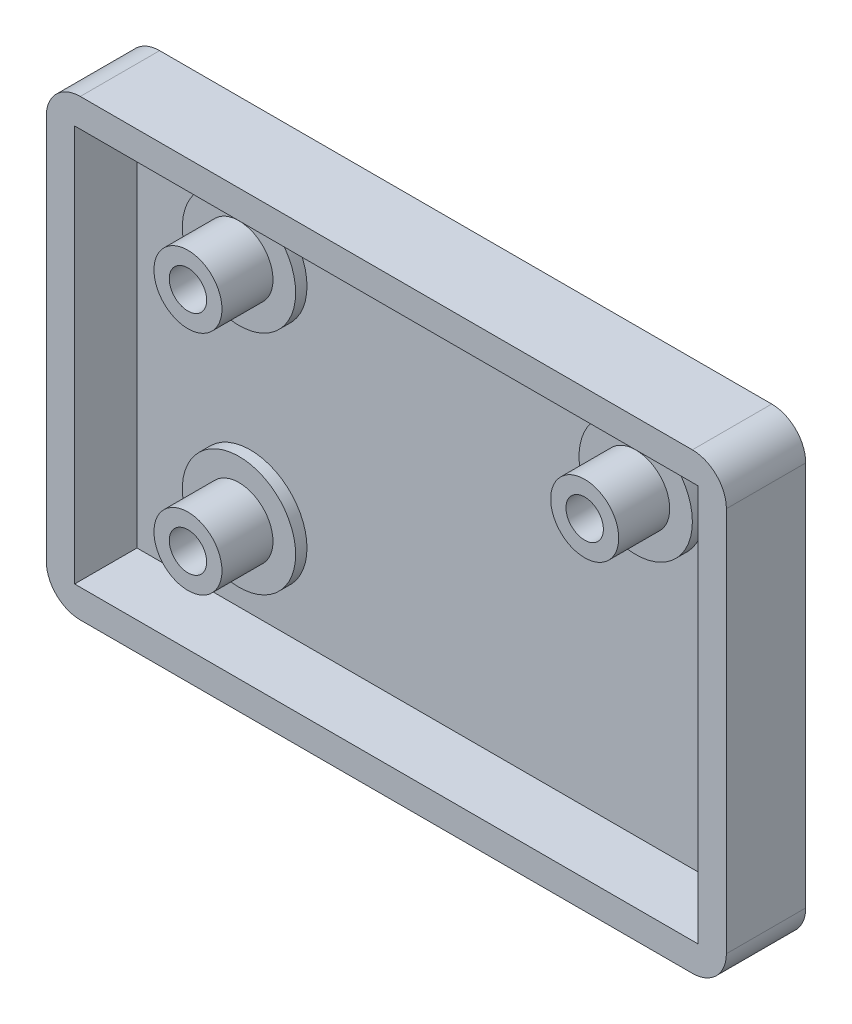
ISO-10303-21;
HEADER;
FILE_DESCRIPTION(('STEP AP214'),'2;1');
FILE_NAME('part.step','',(''),(''),'','','');
FILE_SCHEMA(('AUTOMOTIVE_DESIGN { 1 0 10303 214 1 1 1 1 }'));
ENDSEC;
DATA;
#1=APPLICATION_CONTEXT('core data for automotive mechanical design processes');
#2=APPLICATION_PROTOCOL_DEFINITION('international standard','automotive_design',2000,#1);
#3=PRODUCT_CONTEXT('',#1,'mechanical');
#4=PRODUCT('Part','Part','',(#3));
#5=PRODUCT_RELATED_PRODUCT_CATEGORY('part','',(#4));
#6=PRODUCT_DEFINITION_FORMATION('','',#4);
#7=PRODUCT_DEFINITION_CONTEXT('part definition',#1,'design');
#8=PRODUCT_DEFINITION('design','',#6,#7);
#9=PRODUCT_DEFINITION_SHAPE('','',#8);
#10=(LENGTH_UNIT() NAMED_UNIT(*) SI_UNIT(.MILLI.,.METRE.));
#11=(NAMED_UNIT(*) PLANE_ANGLE_UNIT() SI_UNIT($,.RADIAN.));
#12=(NAMED_UNIT(*) SI_UNIT($,.STERADIAN.) SOLID_ANGLE_UNIT());
#13=UNCERTAINTY_MEASURE_WITH_UNIT(LENGTH_MEASURE(1.E-05),#10,'distance_accuracy_value','');
#14=(GEOMETRIC_REPRESENTATION_CONTEXT(3) GLOBAL_UNCERTAINTY_ASSIGNED_CONTEXT((#13)) GLOBAL_UNIT_ASSIGNED_CONTEXT((#10,
#11,#12)) REPRESENTATION_CONTEXT('',''));
#15=CARTESIAN_POINT('',(0.,0.,0.));
#16=DIRECTION('',(0.,0.,1.));
#17=DIRECTION('',(1.,0.,0.));
#18=AXIS2_PLACEMENT_3D('',#15,#16,#17);
#19=CARTESIAN_POINT('',(-17.5,-10.,2.5));
#20=DIRECTION('',(0.,0.,1.));
#21=DIRECTION('',(1.,0.,0.));
#22=AXIS2_PLACEMENT_3D('',#19,#20,#21);
#23=PLANE('',#22);
#24=CARTESIAN_POINT('',(-17.5,-10.,2.5));
#25=DIRECTION('',(0.,0.,1.));
#26=DIRECTION('',(1.,0.,0.));
#27=AXIS2_PLACEMENT_3D('',#24,#25,#26);
#28=CIRCLE('',#27,5.);
#29=CARTESIAN_POINT('',(-12.5,-10.,2.5));
#30=VERTEX_POINT('',#29);
#31=EDGE_CURVE('E508',#30,#30,#28,.T.);
#32=ORIENTED_EDGE('',*,*,#31,.T.);
#33=EDGE_LOOP('',(#32));
#34=FACE_BOUND('',#33,.T.);
#35=CARTESIAN_POINT('',(-17.5,-10.,2.5));
#36=DIRECTION('',(0.,0.,1.));
#37=DIRECTION('',(1.,0.,0.));
#38=AXIS2_PLACEMENT_3D('',#35,#36,#37);
#39=CIRCLE('',#38,3.);
#40=CARTESIAN_POINT('',(-14.5,-10.,2.5));
#41=VERTEX_POINT('',#40);
#42=EDGE_CURVE('E482',#41,#41,#39,.T.);
#43=ORIENTED_EDGE('',*,*,#42,.F.);
#44=EDGE_LOOP('',(#43));
#45=FACE_BOUND('',#44,.T.);
#46=ADVANCED_FACE('F33',(#34,#45),#23,.T.);
#47=CARTESIAN_POINT('',(17.5,10.,2.5));
#48=DIRECTION('',(0.,0.,1.));
#49=DIRECTION('',(1.,0.,0.));
#50=AXIS2_PLACEMENT_3D('',#47,#48,#49);
#51=PLANE('',#50);
#52=CARTESIAN_POINT('',(17.5,10.,2.5));
#53=DIRECTION('',(0.,0.,1.));
#54=DIRECTION('',(1.,0.,0.));
#55=AXIS2_PLACEMENT_3D('',#52,#53,#54);
#56=CIRCLE('',#55,5.);
#57=CARTESIAN_POINT('',(22.5,10.,2.5));
#58=VERTEX_POINT('',#57);
#59=EDGE_CURVE('E513',#58,#58,#56,.T.);
#60=ORIENTED_EDGE('',*,*,#59,.T.);
#61=EDGE_LOOP('',(#60));
#62=FACE_BOUND('',#61,.T.);
#63=CARTESIAN_POINT('',(17.5,10.,2.5));
#64=DIRECTION('',(0.,0.,1.));
#65=DIRECTION('',(1.,0.,0.));
#66=AXIS2_PLACEMENT_3D('',#63,#64,#65);
#67=CIRCLE('',#66,3.);
#68=CARTESIAN_POINT('',(20.5,10.,2.5));
#69=VERTEX_POINT('',#68);
#70=EDGE_CURVE('E492',#69,#69,#67,.T.);
#71=ORIENTED_EDGE('',*,*,#70,.F.);
#72=EDGE_LOOP('',(#71));
#73=FACE_BOUND('',#72,.T.);
#74=ADVANCED_FACE('F263',(#62,#73),#51,.T.);
#75=CARTESIAN_POINT('',(-17.5,10.,2.5));
#76=DIRECTION('',(0.,0.,1.));
#77=DIRECTION('',(1.,0.,0.));
#78=AXIS2_PLACEMENT_3D('',#75,#76,#77);
#79=PLANE('',#78);
#80=CARTESIAN_POINT('',(-17.5,10.,2.5));
#81=DIRECTION('',(0.,0.,1.));
#82=DIRECTION('',(1.,0.,0.));
#83=AXIS2_PLACEMENT_3D('',#80,#81,#82);
#84=CIRCLE('',#83,5.);
#85=CARTESIAN_POINT('',(-12.5,10.,2.5));
#86=VERTEX_POINT('',#85);
#87=EDGE_CURVE('E519',#86,#86,#84,.T.);
#88=ORIENTED_EDGE('',*,*,#87,.T.);
#89=EDGE_LOOP('',(#88));
#90=FACE_BOUND('',#89,.T.);
#91=CARTESIAN_POINT('',(-17.5,10.,2.5));
#92=DIRECTION('',(0.,0.,1.));
#93=DIRECTION('',(1.,0.,0.));
#94=AXIS2_PLACEMENT_3D('',#91,#92,#93);
#95=CIRCLE('',#94,3.);
#96=CARTESIAN_POINT('',(-14.5,10.,2.5));
#97=VERTEX_POINT('',#96);
#98=EDGE_CURVE('E501',#97,#97,#95,.T.);
#99=ORIENTED_EDGE('',*,*,#98,.F.);
#100=EDGE_LOOP('',(#99));
#101=FACE_BOUND('',#100,.T.);
#102=ADVANCED_FACE('F269',(#90,#101),#79,.T.);
#103=CARTESIAN_POINT('',(0.,0.,1.5));
#104=DIRECTION('',(0.,0.,1.));
#105=DIRECTION('',(1.,0.,0.));
#106=AXIS2_PLACEMENT_3D('',#103,#104,#105);
#107=PLANE('',#106);
#108=CARTESIAN_POINT('',(17.5,10.,1.5));
#109=DIRECTION('',(0.,0.,1.));
#110=DIRECTION('',(1.,0.,0.));
#111=AXIS2_PLACEMENT_3D('',#108,#109,#110);
#112=CIRCLE('',#111,5.);
#113=CARTESIAN_POINT('',(22.5,10.,1.5));
#114=VERTEX_POINT('',#113);
#115=EDGE_CURVE('E510',#114,#114,#112,.T.);
#116=ORIENTED_EDGE('',*,*,#115,.F.);
#117=EDGE_LOOP('',(#116));
#118=FACE_BOUND('',#117,.T.);
#119=DIRECTION('',(0.,-1.,0.));
#120=VECTOR('',#119,1.);
#121=CARTESIAN_POINT('',(-27.5,-17.5,1.5));
#122=LINE('',#121,#120);
#123=CARTESIAN_POINT('',(-27.5,17.5,1.5));
#124=VERTEX_POINT('',#123);
#125=CARTESIAN_POINT('',(-27.5,-17.5,1.5));
#126=VERTEX_POINT('',#125);
#127=EDGE_CURVE('E127',#124,#126,#122,.T.);
#128=ORIENTED_EDGE('',*,*,#127,.T.);
#129=DIRECTION('',(1.,0.,0.));
#130=VECTOR('',#129,1.);
#131=CARTESIAN_POINT('',(27.5,-17.5,1.5));
#132=LINE('',#131,#130);
#133=CARTESIAN_POINT('',(27.5,-17.5,1.5));
#134=VERTEX_POINT('',#133);
#135=EDGE_CURVE('E138',#126,#134,#132,.T.);
#136=ORIENTED_EDGE('',*,*,#135,.T.);
#137=DIRECTION('',(0.,1.,0.));
#138=VECTOR('',#137,1.);
#139=CARTESIAN_POINT('',(27.5,-17.5,1.5));
#140=LINE('',#139,#138);
#141=CARTESIAN_POINT('',(27.5,17.5,1.5));
#142=VERTEX_POINT('',#141);
#143=EDGE_CURVE('E143',#134,#142,#140,.T.);
#144=ORIENTED_EDGE('',*,*,#143,.T.);
#145=DIRECTION('',(-1.,0.,0.));
#146=VECTOR('',#145,1.);
#147=CARTESIAN_POINT('',(27.5,17.5,1.5));
#148=LINE('',#147,#146);
#149=EDGE_CURVE('E135',#142,#124,#148,.T.);
#150=ORIENTED_EDGE('',*,*,#149,.T.);
#151=EDGE_LOOP('',(#128,#136,#144,#150));
#152=FACE_BOUND('',#151,.T.);
#153=CARTESIAN_POINT('',(-17.5,10.,1.5));
#154=DIRECTION('',(0.,0.,1.));
#155=DIRECTION('',(1.,0.,0.));
#156=AXIS2_PLACEMENT_3D('',#153,#154,#155);
#157=CIRCLE('',#156,5.);
#158=CARTESIAN_POINT('',(-12.5,10.,1.5));
#159=VERTEX_POINT('',#158);
#160=EDGE_CURVE('E516',#159,#159,#157,.T.);
#161=ORIENTED_EDGE('',*,*,#160,.F.);
#162=EDGE_LOOP('',(#161));
#163=FACE_BOUND('',#162,.T.);
#164=CARTESIAN_POINT('',(-17.5,-10.,1.5));
#165=DIRECTION('',(0.,0.,1.));
#166=DIRECTION('',(1.,0.,0.));
#167=AXIS2_PLACEMENT_3D('',#164,#165,#166);
#168=CIRCLE('',#167,5.);
#169=CARTESIAN_POINT('',(-12.5,-10.,1.5));
#170=VERTEX_POINT('',#169);
#171=EDGE_CURVE('E505',#170,#170,#168,.T.);
#172=ORIENTED_EDGE('',*,*,#171,.F.);
#173=EDGE_LOOP('',(#172));
#174=FACE_BOUND('',#173,.T.);
#175=ADVANCED_FACE('F145',(#118,#152,#163,#174),#107,.T.);
#176=CARTESIAN_POINT('',(-30.,-20.,7.));
#177=DIRECTION('',(1.,0.,0.));
#178=DIRECTION('',(0.,0.,-1.));
#179=AXIS2_PLACEMENT_3D('',#176,#177,#178);
#180=PLANE('',#179);
#181=DIRECTION('',(0.,-1.,0.));
#182=VECTOR('',#181,1.);
#183=CARTESIAN_POINT('',(-30.,-20.,0.));
#184=LINE('',#183,#182);
#185=CARTESIAN_POINT('',(-30.,17.,0.));
#186=VERTEX_POINT('',#185);
#187=CARTESIAN_POINT('',(-30.,-17.,0.));
#188=VERTEX_POINT('',#187);
#189=EDGE_CURVE('E166',#186,#188,#184,.T.);
#190=ORIENTED_EDGE('',*,*,#189,.T.);
#191=DIRECTION('',(0.,0.,-1.));
#192=VECTOR('',#191,1.);
#193=CARTESIAN_POINT('',(-30.,-17.,7.));
#194=LINE('',#193,#192);
#195=CARTESIAN_POINT('',(-30.,-17.,7.));
#196=VERTEX_POINT('',#195);
#197=EDGE_CURVE('E11',#188,#196,#194,.F.);
#198=ORIENTED_EDGE('',*,*,#197,.T.);
#199=DIRECTION('',(0.,-1.,0.));
#200=VECTOR('',#199,1.);
#201=CARTESIAN_POINT('',(-30.,-20.,7.));
#202=LINE('',#201,#200);
#203=CARTESIAN_POINT('',(-30.,17.,7.));
#204=VERTEX_POINT('',#203);
#205=EDGE_CURVE('E170',#204,#196,#202,.T.);
#206=ORIENTED_EDGE('',*,*,#205,.F.);
#207=DIRECTION('',(0.,0.,-1.));
#208=VECTOR('',#207,1.);
#209=CARTESIAN_POINT('',(-30.,17.,7.));
#210=LINE('',#209,#208);
#211=EDGE_CURVE('E41',#204,#186,#210,.T.);
#212=ORIENTED_EDGE('',*,*,#211,.T.);
#213=EDGE_LOOP('',(#190,#198,#206,#212));
#214=FACE_BOUND('',#213,.T.);
#215=ADVANCED_FACE('F223',(#214),#180,.F.);
#216=CARTESIAN_POINT('',(30.,-20.,7.));
#217=DIRECTION('',(0.,1.,0.));
#218=DIRECTION('',(-1.,0.,0.));
#219=AXIS2_PLACEMENT_3D('',#216,#217,#218);
#220=PLANE('',#219);
#221=DIRECTION('',(1.,0.,0.));
#222=VECTOR('',#221,1.);
#223=CARTESIAN_POINT('',(30.,-20.,0.));
#224=LINE('',#223,#222);
#225=CARTESIAN_POINT('',(-27.,-20.,0.));
#226=VERTEX_POINT('',#225);
#227=CARTESIAN_POINT('',(27.,-20.,0.));
#228=VERTEX_POINT('',#227);
#229=EDGE_CURVE('E184',#226,#228,#224,.T.);
#230=ORIENTED_EDGE('',*,*,#229,.T.);
#231=DIRECTION('',(0.,0.,-1.));
#232=VECTOR('',#231,1.);
#233=CARTESIAN_POINT('',(27.,-20.,7.));
#234=LINE('',#233,#232);
#235=CARTESIAN_POINT('',(27.,-20.,7.));
#236=VERTEX_POINT('',#235);
#237=EDGE_CURVE('E48',#228,#236,#234,.F.);
#238=ORIENTED_EDGE('',*,*,#237,.T.);
#239=DIRECTION('',(1.,0.,0.));
#240=VECTOR('',#239,1.);
#241=CARTESIAN_POINT('',(30.,-20.,7.));
#242=LINE('',#241,#240);
#243=CARTESIAN_POINT('',(-27.,-20.,7.));
#244=VERTEX_POINT('',#243);
#245=EDGE_CURVE('E172',#244,#236,#242,.T.);
#246=ORIENTED_EDGE('',*,*,#245,.F.);
#247=DIRECTION('',(0.,0.,-1.));
#248=VECTOR('',#247,1.);
#249=CARTESIAN_POINT('',(-27.,-20.,7.));
#250=LINE('',#249,#248);
#251=EDGE_CURVE('E215',#244,#226,#250,.T.);
#252=ORIENTED_EDGE('',*,*,#251,.T.);
#253=EDGE_LOOP('',(#230,#238,#246,#252));
#254=FACE_BOUND('',#253,.T.);
#255=ADVANCED_FACE('F234',(#254),#220,.F.);
#256=CARTESIAN_POINT('',(30.,-20.,7.));
#257=DIRECTION('',(-1.,0.,0.));
#258=DIRECTION('',(0.,0.,1.));
#259=AXIS2_PLACEMENT_3D('',#256,#257,#258);
#260=PLANE('',#259);
#261=DIRECTION('',(0.,1.,0.));
#262=VECTOR('',#261,1.);
#263=CARTESIAN_POINT('',(30.,-20.,0.));
#264=LINE('',#263,#262);
#265=CARTESIAN_POINT('',(30.,-17.,0.));
#266=VERTEX_POINT('',#265);
#267=CARTESIAN_POINT('',(30.,17.,0.));
#268=VERTEX_POINT('',#267);
#269=EDGE_CURVE('E186',#266,#268,#264,.T.);
#270=ORIENTED_EDGE('',*,*,#269,.T.);
#271=DIRECTION('',(0.,0.,-1.));
#272=VECTOR('',#271,1.);
#273=CARTESIAN_POINT('',(30.,17.,7.));
#274=LINE('',#273,#272);
#275=CARTESIAN_POINT('',(30.,17.,7.));
#276=VERTEX_POINT('',#275);
#277=EDGE_CURVE('E206',#268,#276,#274,.F.);
#278=ORIENTED_EDGE('',*,*,#277,.T.);
#279=DIRECTION('',(0.,1.,0.));
#280=VECTOR('',#279,1.);
#281=CARTESIAN_POINT('',(30.,-20.,7.));
#282=LINE('',#281,#280);
#283=CARTESIAN_POINT('',(30.,-17.,7.));
#284=VERTEX_POINT('',#283);
#285=EDGE_CURVE('E175',#284,#276,#282,.T.);
#286=ORIENTED_EDGE('',*,*,#285,.F.);
#287=DIRECTION('',(0.,0.,-1.));
#288=VECTOR('',#287,1.);
#289=CARTESIAN_POINT('',(30.,-17.,7.));
#290=LINE('',#289,#288);
#291=EDGE_CURVE('E203',#284,#266,#290,.T.);
#292=ORIENTED_EDGE('',*,*,#291,.T.);
#293=EDGE_LOOP('',(#270,#278,#286,#292));
#294=FACE_BOUND('',#293,.T.);
#295=ADVANCED_FACE('F243',(#294),#260,.F.);
#296=CARTESIAN_POINT('',(30.,20.,7.));
#297=DIRECTION('',(0.,-1.,0.));
#298=DIRECTION('',(1.,0.,0.));
#299=AXIS2_PLACEMENT_3D('',#296,#297,#298);
#300=PLANE('',#299);
#301=DIRECTION('',(-1.,0.,0.));
#302=VECTOR('',#301,1.);
#303=CARTESIAN_POINT('',(30.,20.,7.));
#304=LINE('',#303,#302);
#305=CARTESIAN_POINT('',(27.,20.,7.));
#306=VERTEX_POINT('',#305);
#307=CARTESIAN_POINT('',(-27.,20.,7.));
#308=VERTEX_POINT('',#307);
#309=EDGE_CURVE('E178',#306,#308,#304,.T.);
#310=ORIENTED_EDGE('',*,*,#309,.F.);
#311=DIRECTION('',(0.,0.,-1.));
#312=VECTOR('',#311,1.);
#313=CARTESIAN_POINT('',(27.,20.,7.));
#314=LINE('',#313,#312);
#315=CARTESIAN_POINT('',(27.,20.,0.));
#316=VERTEX_POINT('',#315);
#317=EDGE_CURVE('E192',#306,#316,#314,.T.);
#318=ORIENTED_EDGE('',*,*,#317,.T.);
#319=DIRECTION('',(-1.,0.,0.));
#320=VECTOR('',#319,1.);
#321=CARTESIAN_POINT('',(30.,20.,0.));
#322=LINE('',#321,#320);
#323=CARTESIAN_POINT('',(-27.,20.,0.));
#324=VERTEX_POINT('',#323);
#325=EDGE_CURVE('E173',#316,#324,#322,.T.);
#326=ORIENTED_EDGE('',*,*,#325,.T.);
#327=DIRECTION('',(0.,0.,-1.));
#328=VECTOR('',#327,1.);
#329=CARTESIAN_POINT('',(-27.,20.,7.));
#330=LINE('',#329,#328);
#331=EDGE_CURVE('E181',#324,#308,#330,.F.);
#332=ORIENTED_EDGE('',*,*,#331,.T.);
#333=EDGE_LOOP('',(#310,#318,#326,#332));
#334=FACE_BOUND('',#333,.T.);
#335=ADVANCED_FACE('F251',(#334),#300,.F.);
#336=CARTESIAN_POINT('',(0.,0.,7.));
#337=DIRECTION('',(0.,0.,1.));
#338=DIRECTION('',(1.,0.,0.));
#339=AXIS2_PLACEMENT_3D('',#336,#337,#338);
#340=PLANE('',#339);
#341=DIRECTION('',(0.,-1.,0.));
#342=VECTOR('',#341,1.);
#343=CARTESIAN_POINT('',(-27.5,-17.5,7.));
#344=LINE('',#343,#342);
#345=CARTESIAN_POINT('',(-27.5,17.5,7.));
#346=VERTEX_POINT('',#345);
#347=CARTESIAN_POINT('',(-27.5,-17.5,7.));
#348=VERTEX_POINT('',#347);
#349=EDGE_CURVE('E130',#346,#348,#344,.T.);
#350=ORIENTED_EDGE('',*,*,#349,.F.);
#351=DIRECTION('',(-1.,0.,0.));
#352=VECTOR('',#351,1.);
#353=CARTESIAN_POINT('',(27.5,17.5,7.));
#354=LINE('',#353,#352);
#355=CARTESIAN_POINT('',(27.5,17.5,7.));
#356=VERTEX_POINT('',#355);
#357=EDGE_CURVE('E148',#356,#346,#354,.T.);
#358=ORIENTED_EDGE('',*,*,#357,.F.);
#359=DIRECTION('',(0.,1.,0.));
#360=VECTOR('',#359,1.);
#361=CARTESIAN_POINT('',(27.5,-17.5,7.));
#362=LINE('',#361,#360);
#363=CARTESIAN_POINT('',(27.5,-17.5,7.));
#364=VERTEX_POINT('',#363);
#365=EDGE_CURVE('E151',#364,#356,#362,.T.);
#366=ORIENTED_EDGE('',*,*,#365,.F.);
#367=DIRECTION('',(1.,0.,0.));
#368=VECTOR('',#367,1.);
#369=CARTESIAN_POINT('',(27.5,-17.5,7.));
#370=LINE('',#369,#368);
#371=EDGE_CURVE('E160',#348,#364,#370,.T.);
#372=ORIENTED_EDGE('',*,*,#371,.F.);
#373=EDGE_LOOP('',(#350,#358,#366,#372));
#374=FACE_BOUND('',#373,.T.);
#375=ORIENTED_EDGE('',*,*,#285,.T.);
#376=CARTESIAN_POINT('',(27.,17.,7.));
#377=DIRECTION('',(0.,0.,1.));
#378=DIRECTION('',(1.,0.,0.));
#379=AXIS2_PLACEMENT_3D('',#376,#377,#378);
#380=CIRCLE('',#379,3.);
#381=EDGE_CURVE('E213',#276,#306,#380,.T.);
#382=ORIENTED_EDGE('',*,*,#381,.T.);
#383=ORIENTED_EDGE('',*,*,#309,.T.);
#384=CARTESIAN_POINT('',(-27.,17.,7.));
#385=DIRECTION('',(0.,0.,1.));
#386=DIRECTION('',(1.,0.,0.));
#387=AXIS2_PLACEMENT_3D('',#384,#385,#386);
#388=CIRCLE('',#387,3.);
#389=EDGE_CURVE('E208',#308,#204,#388,.T.);
#390=ORIENTED_EDGE('',*,*,#389,.T.);
#391=ORIENTED_EDGE('',*,*,#205,.T.);
#392=CARTESIAN_POINT('',(-27.,-17.,7.));
#393=DIRECTION('',(0.,0.,1.));
#394=DIRECTION('',(1.,0.,0.));
#395=AXIS2_PLACEMENT_3D('',#392,#393,#394);
#396=CIRCLE('',#395,3.);
#397=EDGE_CURVE('E55',#196,#244,#396,.T.);
#398=ORIENTED_EDGE('',*,*,#397,.T.);
#399=ORIENTED_EDGE('',*,*,#245,.T.);
#400=CARTESIAN_POINT('',(27.,-17.,7.));
#401=DIRECTION('',(0.,0.,1.));
#402=DIRECTION('',(1.,0.,0.));
#403=AXIS2_PLACEMENT_3D('',#400,#401,#402);
#404=CIRCLE('',#403,3.);
#405=EDGE_CURVE('E211',#236,#284,#404,.T.);
#406=ORIENTED_EDGE('',*,*,#405,.T.);
#407=EDGE_LOOP('',(#375,#382,#383,#390,#391,#398,#399,#406));
#408=FACE_BOUND('',#407,.T.);
#409=ADVANCED_FACE('F236',(#374,#408),#340,.T.);
#410=CARTESIAN_POINT('',(0.,0.,0.));
#411=DIRECTION('',(0.,0.,1.));
#412=DIRECTION('',(1.,0.,0.));
#413=AXIS2_PLACEMENT_3D('',#410,#411,#412);
#414=PLANE('',#413);
#415=CARTESIAN_POINT('',(-17.5,-10.,0.));
#416=DIRECTION('',(0.,0.,-1.));
#417=DIRECTION('',(-1.,0.,0.));
#418=AXIS2_PLACEMENT_3D('',#415,#416,#417);
#419=CIRCLE('',#418,1.65);
#420=CARTESIAN_POINT('',(-19.15,-10.,0.));
#421=VERTEX_POINT('',#420);
#422=EDGE_CURVE('E522',#421,#421,#419,.T.);
#423=ORIENTED_EDGE('',*,*,#422,.F.);
#424=EDGE_LOOP('',(#423));
#425=FACE_BOUND('',#424,.T.);
#426=CARTESIAN_POINT('',(-17.5,10.,0.));
#427=DIRECTION('',(0.,0.,-1.));
#428=DIRECTION('',(-1.,0.,0.));
#429=AXIS2_PLACEMENT_3D('',#426,#427,#428);
#430=CIRCLE('',#429,1.65);
#431=CARTESIAN_POINT('',(-19.15,10.,0.));
#432=VERTEX_POINT('',#431);
#433=EDGE_CURVE('E526',#432,#432,#430,.T.);
#434=ORIENTED_EDGE('',*,*,#433,.F.);
#435=EDGE_LOOP('',(#434));
#436=FACE_BOUND('',#435,.T.);
#437=CARTESIAN_POINT('',(17.5,10.,0.));
#438=DIRECTION('',(0.,0.,-1.));
#439=DIRECTION('',(-1.,0.,0.));
#440=AXIS2_PLACEMENT_3D('',#437,#438,#439);
#441=CIRCLE('',#440,1.65);
#442=CARTESIAN_POINT('',(15.85,10.,0.));
#443=VERTEX_POINT('',#442);
#444=EDGE_CURVE('E154',#443,#443,#441,.T.);
#445=ORIENTED_EDGE('',*,*,#444,.F.);
#446=EDGE_LOOP('',(#445));
#447=FACE_BOUND('',#446,.T.);
#448=ORIENTED_EDGE('',*,*,#325,.F.);
#449=CARTESIAN_POINT('',(27.,17.,0.));
#450=DIRECTION('',(0.,0.,1.));
#451=DIRECTION('',(1.,0.,0.));
#452=AXIS2_PLACEMENT_3D('',#449,#450,#451);
#453=CIRCLE('',#452,3.);
#454=EDGE_CURVE('E201',#316,#268,#453,.F.);
#455=ORIENTED_EDGE('',*,*,#454,.T.);
#456=ORIENTED_EDGE('',*,*,#269,.F.);
#457=CARTESIAN_POINT('',(27.,-17.,0.));
#458=DIRECTION('',(0.,0.,1.));
#459=DIRECTION('',(1.,0.,0.));
#460=AXIS2_PLACEMENT_3D('',#457,#458,#459);
#461=CIRCLE('',#460,3.);
#462=EDGE_CURVE('E199',#266,#228,#461,.F.);
#463=ORIENTED_EDGE('',*,*,#462,.T.);
#464=ORIENTED_EDGE('',*,*,#229,.F.);
#465=CARTESIAN_POINT('',(-27.,-17.,0.));
#466=DIRECTION('',(0.,0.,1.));
#467=DIRECTION('',(1.,0.,0.));
#468=AXIS2_PLACEMENT_3D('',#465,#466,#467);
#469=CIRCLE('',#468,3.);
#470=EDGE_CURVE('E197',#226,#188,#469,.F.);
#471=ORIENTED_EDGE('',*,*,#470,.T.);
#472=ORIENTED_EDGE('',*,*,#189,.F.);
#473=CARTESIAN_POINT('',(-27.,17.,0.));
#474=DIRECTION('',(0.,0.,1.));
#475=DIRECTION('',(1.,0.,0.));
#476=AXIS2_PLACEMENT_3D('',#473,#474,#475);
#477=CIRCLE('',#476,3.);
#478=EDGE_CURVE('E195',#186,#324,#477,.F.);
#479=ORIENTED_EDGE('',*,*,#478,.T.);
#480=EDGE_LOOP('',(#448,#455,#456,#463,#464,#471,#472,#479));
#481=FACE_BOUND('',#480,.T.);
#482=ADVANCED_FACE('F229',(#425,#436,#447,#481),#414,.F.);
#483=CARTESIAN_POINT('',(-27.5,-17.5,1.5));
#484=DIRECTION('',(-1.,0.,0.));
#485=DIRECTION('',(0.,0.,1.));
#486=AXIS2_PLACEMENT_3D('',#483,#484,#485);
#487=PLANE('',#486);
#488=ORIENTED_EDGE('',*,*,#349,.T.);
#489=DIRECTION('',(0.,0.,1.));
#490=VECTOR('',#489,1.);
#491=CARTESIAN_POINT('',(-27.5,-17.5,1.5));
#492=LINE('',#491,#490);
#493=EDGE_CURVE('E123',#126,#348,#492,.T.);
#494=ORIENTED_EDGE('',*,*,#493,.F.);
#495=ORIENTED_EDGE('',*,*,#127,.F.);
#496=DIRECTION('',(0.,0.,1.));
#497=VECTOR('',#496,1.);
#498=CARTESIAN_POINT('',(-27.5,17.5,1.5));
#499=LINE('',#498,#497);
#500=EDGE_CURVE('E164',#124,#346,#499,.T.);
#501=ORIENTED_EDGE('',*,*,#500,.T.);
#502=EDGE_LOOP('',(#488,#494,#495,#501));
#503=FACE_BOUND('',#502,.T.);
#504=ADVANCED_FACE('F125',(#503),#487,.F.);
#505=CARTESIAN_POINT('',(27.5,17.5,1.5));
#506=DIRECTION('',(0.,1.,0.));
#507=DIRECTION('',(-1.,0.,0.));
#508=AXIS2_PLACEMENT_3D('',#505,#506,#507);
#509=PLANE('',#508);
#510=ORIENTED_EDGE('',*,*,#357,.T.);
#511=ORIENTED_EDGE('',*,*,#500,.F.);
#512=ORIENTED_EDGE('',*,*,#149,.F.);
#513=DIRECTION('',(0.,0.,1.));
#514=VECTOR('',#513,1.);
#515=CARTESIAN_POINT('',(27.5,17.5,1.5));
#516=LINE('',#515,#514);
#517=EDGE_CURVE('E167',#142,#356,#516,.T.);
#518=ORIENTED_EDGE('',*,*,#517,.T.);
#519=EDGE_LOOP('',(#510,#511,#512,#518));
#520=FACE_BOUND('',#519,.T.);
#521=ADVANCED_FACE('F304',(#520),#509,.F.);
#522=CARTESIAN_POINT('',(27.5,-17.5,1.5));
#523=DIRECTION('',(1.,0.,0.));
#524=DIRECTION('',(0.,0.,-1.));
#525=AXIS2_PLACEMENT_3D('',#522,#523,#524);
#526=PLANE('',#525);
#527=ORIENTED_EDGE('',*,*,#365,.T.);
#528=ORIENTED_EDGE('',*,*,#517,.F.);
#529=ORIENTED_EDGE('',*,*,#143,.F.);
#530=DIRECTION('',(0.,0.,1.));
#531=VECTOR('',#530,1.);
#532=CARTESIAN_POINT('',(27.5,-17.5,1.5));
#533=LINE('',#532,#531);
#534=EDGE_CURVE('E134',#134,#364,#533,.T.);
#535=ORIENTED_EDGE('',*,*,#534,.T.);
#536=EDGE_LOOP('',(#527,#528,#529,#535));
#537=FACE_BOUND('',#536,.T.);
#538=ADVANCED_FACE('F307',(#537),#526,.F.);
#539=CARTESIAN_POINT('',(27.5,-17.5,1.5));
#540=DIRECTION('',(0.,-1.,0.));
#541=DIRECTION('',(1.,0.,0.));
#542=AXIS2_PLACEMENT_3D('',#539,#540,#541);
#543=PLANE('',#542);
#544=ORIENTED_EDGE('',*,*,#371,.T.);
#545=ORIENTED_EDGE('',*,*,#534,.F.);
#546=ORIENTED_EDGE('',*,*,#135,.F.);
#547=ORIENTED_EDGE('',*,*,#493,.T.);
#548=EDGE_LOOP('',(#544,#545,#546,#547));
#549=FACE_BOUND('',#548,.T.);
#550=ADVANCED_FACE('F139',(#549),#543,.F.);
#551=CARTESIAN_POINT('',(27.,17.,7.));
#552=DIRECTION('',(0.,0.,-1.));
#553=DIRECTION('',(-1.,0.,0.));
#554=AXIS2_PLACEMENT_3D('',#551,#552,#553);
#555=CYLINDRICAL_SURFACE('',#554,3.);
#556=ORIENTED_EDGE('',*,*,#381,.F.);
#557=ORIENTED_EDGE('',*,*,#277,.F.);
#558=ORIENTED_EDGE('',*,*,#454,.F.);
#559=ORIENTED_EDGE('',*,*,#317,.F.);
#560=EDGE_LOOP('',(#556,#557,#558,#559));
#561=FACE_BOUND('',#560,.T.);
#562=ADVANCED_FACE('F248',(#561),#555,.T.);
#563=CARTESIAN_POINT('',(27.,-17.,7.));
#564=DIRECTION('',(0.,0.,-1.));
#565=DIRECTION('',(-1.,0.,0.));
#566=AXIS2_PLACEMENT_3D('',#563,#564,#565);
#567=CYLINDRICAL_SURFACE('',#566,3.);
#568=ORIENTED_EDGE('',*,*,#405,.F.);
#569=ORIENTED_EDGE('',*,*,#237,.F.);
#570=ORIENTED_EDGE('',*,*,#462,.F.);
#571=ORIENTED_EDGE('',*,*,#291,.F.);
#572=EDGE_LOOP('',(#568,#569,#570,#571));
#573=FACE_BOUND('',#572,.T.);
#574=ADVANCED_FACE('F240',(#573),#567,.T.);
#575=CARTESIAN_POINT('',(-27.,-17.,7.));
#576=DIRECTION('',(0.,0.,-1.));
#577=DIRECTION('',(-1.,0.,0.));
#578=AXIS2_PLACEMENT_3D('',#575,#576,#577);
#579=CYLINDRICAL_SURFACE('',#578,3.);
#580=ORIENTED_EDGE('',*,*,#397,.F.);
#581=ORIENTED_EDGE('',*,*,#197,.F.);
#582=ORIENTED_EDGE('',*,*,#470,.F.);
#583=ORIENTED_EDGE('',*,*,#251,.F.);
#584=EDGE_LOOP('',(#580,#581,#582,#583));
#585=FACE_BOUND('',#584,.T.);
#586=ADVANCED_FACE('F233',(#585),#579,.T.);
#587=CARTESIAN_POINT('',(-27.,17.,7.));
#588=DIRECTION('',(0.,0.,-1.));
#589=DIRECTION('',(-1.,0.,0.));
#590=AXIS2_PLACEMENT_3D('',#587,#588,#589);
#591=CYLINDRICAL_SURFACE('',#590,3.);
#592=ORIENTED_EDGE('',*,*,#389,.F.);
#593=ORIENTED_EDGE('',*,*,#331,.F.);
#594=ORIENTED_EDGE('',*,*,#478,.F.);
#595=ORIENTED_EDGE('',*,*,#211,.F.);
#596=EDGE_LOOP('',(#592,#593,#594,#595));
#597=FACE_BOUND('',#596,.T.);
#598=ADVANCED_FACE('F35',(#597),#591,.T.);
#599=CARTESIAN_POINT('',(17.5,10.,30.5));
#600=DIRECTION('',(0.,0.,-1.));
#601=DIRECTION('',(-1.,0.,0.));
#602=AXIS2_PLACEMENT_3D('',#599,#600,#601);
#603=CYLINDRICAL_SURFACE('',#602,1.65);
#604=CARTESIAN_POINT('',(17.5,10.,7.));
#605=DIRECTION('',(0.,0.,1.));
#606=DIRECTION('',(1.,0.,0.));
#607=AXIS2_PLACEMENT_3D('',#604,#605,#606);
#608=CIRCLE('',#607,1.65);
#609=CARTESIAN_POINT('',(15.85,10.,7.));
#610=VERTEX_POINT('',#609);
#611=EDGE_CURVE('E485',#610,#610,#608,.T.);
#612=CARTESIAN_POINT('',(15.85,10.,0.));
#613=CARTESIAN_POINT('',(15.85,10.,0.07291666666667));
#614=CARTESIAN_POINT('',(15.85,10.,0.145833333333337));
#615=CARTESIAN_POINT('',(15.85,10.,0.29166666666667));
#616=CARTESIAN_POINT('',(15.85,10.,0.364583333333337));
#617=CARTESIAN_POINT('',(15.85,10.,0.510416666666671));
#618=CARTESIAN_POINT('',(15.85,10.,0.583333333333337));
#619=CARTESIAN_POINT('',(15.85,10.,0.729166666666671));
#620=CARTESIAN_POINT('',(15.85,10.,0.802083333333337));
#621=CARTESIAN_POINT('',(15.85,10.,0.947916666666671));
#622=CARTESIAN_POINT('',(15.85,10.,1.02083333333334));
#623=CARTESIAN_POINT('',(15.85,10.,1.16666666666667));
#624=CARTESIAN_POINT('',(15.85,10.,1.23958333333334));
#625=CARTESIAN_POINT('',(15.85,10.,1.38541666666667));
#626=CARTESIAN_POINT('',(15.85,10.,1.45833333333334));
#627=CARTESIAN_POINT('',(15.85,10.,1.60416666666667));
#628=CARTESIAN_POINT('',(15.85,10.,1.67708333333334));
#629=CARTESIAN_POINT('',(15.85,10.,1.82291666666667));
#630=CARTESIAN_POINT('',(15.85,10.,1.89583333333334));
#631=CARTESIAN_POINT('',(15.85,10.,2.04166666666667));
#632=CARTESIAN_POINT('',(15.85,10.,2.11458333333334));
#633=CARTESIAN_POINT('',(15.85,10.,2.26041666666667));
#634=CARTESIAN_POINT('',(15.85,10.,2.33333333333334));
#635=CARTESIAN_POINT('',(15.85,10.,2.47916666666667));
#636=CARTESIAN_POINT('',(15.85,10.,2.55208333333334));
#637=CARTESIAN_POINT('',(15.85,10.,2.69791666666667));
#638=CARTESIAN_POINT('',(15.85,10.,2.77083333333334));
#639=CARTESIAN_POINT('',(15.85,10.,2.91666666666667));
#640=CARTESIAN_POINT('',(15.85,10.,2.98958333333334));
#641=CARTESIAN_POINT('',(15.85,10.,3.13541666666667));
#642=CARTESIAN_POINT('',(15.85,10.,3.20833333333334));
#643=CARTESIAN_POINT('',(15.85,10.,3.35416666666667));
#644=CARTESIAN_POINT('',(15.85,10.,3.42708333333334));
#645=CARTESIAN_POINT('',(15.85,10.,3.57291666666667));
#646=CARTESIAN_POINT('',(15.85,10.,3.64583333333334));
#647=CARTESIAN_POINT('',(15.85,10.,3.79166666666667));
#648=CARTESIAN_POINT('',(15.85,10.,3.86458333333334));
#649=CARTESIAN_POINT('',(15.85,10.,4.01041666666667));
#650=CARTESIAN_POINT('',(15.85,10.,4.08333333333334));
#651=CARTESIAN_POINT('',(15.85,10.,4.22916666666667));
#652=CARTESIAN_POINT('',(15.85,10.,4.30208333333334));
#653=CARTESIAN_POINT('',(15.85,10.,4.44791666666667));
#654=CARTESIAN_POINT('',(15.85,10.,4.52083333333334));
#655=CARTESIAN_POINT('',(15.85,10.,4.66666666666667));
#656=CARTESIAN_POINT('',(15.85,10.,4.73958333333333));
#657=CARTESIAN_POINT('',(15.85,10.,4.88541666666667));
#658=CARTESIAN_POINT('',(15.85,10.,4.95833333333334));
#659=CARTESIAN_POINT('',(15.85,10.,5.10416666666667));
#660=CARTESIAN_POINT('',(15.85,10.,5.17708333333334));
#661=CARTESIAN_POINT('',(15.85,10.,5.32291666666667));
#662=CARTESIAN_POINT('',(15.85,10.,5.39583333333334));
#663=CARTESIAN_POINT('',(15.85,10.,5.54166666666667));
#664=CARTESIAN_POINT('',(15.85,10.,5.61458333333334));
#665=CARTESIAN_POINT('',(15.85,10.,5.76041666666667));
#666=CARTESIAN_POINT('',(15.85,10.,5.83333333333334));
#667=CARTESIAN_POINT('',(15.85,10.,5.97916666666667));
#668=CARTESIAN_POINT('',(15.85,10.,6.05208333333334));
#669=CARTESIAN_POINT('',(15.85,10.,6.19791666666667));
#670=CARTESIAN_POINT('',(15.85,10.,6.27083333333334));
#671=CARTESIAN_POINT('',(15.85,10.,6.41666666666667));
#672=CARTESIAN_POINT('',(15.85,10.,6.48958333333334));
#673=CARTESIAN_POINT('',(15.85,10.,6.63541666666667));
#674=CARTESIAN_POINT('',(15.85,10.,6.70833333333334));
#675=CARTESIAN_POINT('',(15.85,10.,6.85416666666667));
#676=CARTESIAN_POINT('',(15.85,10.,6.92708333333334));
#677=CARTESIAN_POINT('',(15.85,10.,7.));
#678=B_SPLINE_CURVE_WITH_KNOTS('',3,(#612,#613,#614,#615,#616,#617,#618,#619,#620,#621,#622,
#623,#624,#625,#626,#627,#628,#629,#630,#631,#632,#633,#634,#635,#636,#637,#638,#639,#640,#641,
#642,#643,#644,#645,#646,#647,#648,#649,#650,#651,#652,#653,#654,#655,#656,#657,#658,#659,#660,
#661,#662,#663,#664,#665,#666,#667,#668,#669,#670,#671,#672,#673,#674,#675,#676,#677),
.UNSPECIFIED.,.F.,.F.,(4,2,2,2,2,2,2,2,2,2,2,2,2,2,2,2,2,2,2,2,2,2,2,2,2,2,2,2,2,2,2,2,4),(0.,
0.21875,0.4375,0.656250000000001,0.875000000000001,1.09375,1.3125,1.53125,1.75,1.96875,2.1875,
2.40625,2.625,2.84375,3.0625,3.28125,3.5,3.71875,3.9375,4.15625,4.375,4.59375,4.8125,5.03125,
5.25,5.46875,5.6875,5.90625,6.125,6.34375,6.5625,6.78125,7.),.UNSPECIFIED.);
#679=EDGE_CURVE('BSEAM254',#443,#610,#678,.T.);
#680=ORIENTED_EDGE('',*,*,#444,.T.);
#681=ORIENTED_EDGE('',*,*,#611,.T.);
#682=ORIENTED_EDGE('',*,*,#679,.T.);
#683=ORIENTED_EDGE('',*,*,#679,.F.);
#684=EDGE_LOOP('',(#680,#682,#681,#683));
#685=FACE_BOUND('',#684,.T.);
#686=ADVANCED_FACE('F254',(#685),#603,.F.);
#687=CARTESIAN_POINT('',(-17.5,10.,30.5));
#688=DIRECTION('',(0.,0.,-1.));
#689=DIRECTION('',(-1.,0.,0.));
#690=AXIS2_PLACEMENT_3D('',#687,#688,#689);
#691=CYLINDRICAL_SURFACE('',#690,1.65);
#692=CARTESIAN_POINT('',(-17.5,10.,7.));
#693=DIRECTION('',(0.,0.,1.));
#694=DIRECTION('',(1.,0.,0.));
#695=AXIS2_PLACEMENT_3D('',#692,#693,#694);
#696=CIRCLE('',#695,1.65);
#697=CARTESIAN_POINT('',(-19.15,10.,7.));
#698=VERTEX_POINT('',#697);
#699=EDGE_CURVE('E496',#698,#698,#696,.T.);
#700=CARTESIAN_POINT('',(-19.15,10.,0.));
#701=CARTESIAN_POINT('',(-19.15,10.,0.07291666666667));
#702=CARTESIAN_POINT('',(-19.15,10.,0.145833333333337));
#703=CARTESIAN_POINT('',(-19.15,10.,0.29166666666667));
#704=CARTESIAN_POINT('',(-19.15,10.,0.364583333333337));
#705=CARTESIAN_POINT('',(-19.15,10.,0.510416666666671));
#706=CARTESIAN_POINT('',(-19.15,10.,0.583333333333337));
#707=CARTESIAN_POINT('',(-19.15,10.,0.729166666666671));
#708=CARTESIAN_POINT('',(-19.15,10.,0.802083333333337));
#709=CARTESIAN_POINT('',(-19.15,10.,0.947916666666671));
#710=CARTESIAN_POINT('',(-19.15,10.,1.02083333333334));
#711=CARTESIAN_POINT('',(-19.15,10.,1.16666666666667));
#712=CARTESIAN_POINT('',(-19.15,10.,1.23958333333334));
#713=CARTESIAN_POINT('',(-19.15,10.,1.38541666666667));
#714=CARTESIAN_POINT('',(-19.15,10.,1.45833333333334));
#715=CARTESIAN_POINT('',(-19.15,10.,1.60416666666667));
#716=CARTESIAN_POINT('',(-19.15,10.,1.67708333333334));
#717=CARTESIAN_POINT('',(-19.15,10.,1.82291666666667));
#718=CARTESIAN_POINT('',(-19.15,10.,1.89583333333334));
#719=CARTESIAN_POINT('',(-19.15,10.,2.04166666666667));
#720=CARTESIAN_POINT('',(-19.15,10.,2.11458333333334));
#721=CARTESIAN_POINT('',(-19.15,10.,2.26041666666667));
#722=CARTESIAN_POINT('',(-19.15,10.,2.33333333333334));
#723=CARTESIAN_POINT('',(-19.15,10.,2.47916666666667));
#724=CARTESIAN_POINT('',(-19.15,10.,2.55208333333334));
#725=CARTESIAN_POINT('',(-19.15,10.,2.69791666666667));
#726=CARTESIAN_POINT('',(-19.15,10.,2.77083333333334));
#727=CARTESIAN_POINT('',(-19.15,10.,2.91666666666667));
#728=CARTESIAN_POINT('',(-19.15,10.,2.98958333333334));
#729=CARTESIAN_POINT('',(-19.15,10.,3.13541666666667));
#730=CARTESIAN_POINT('',(-19.15,10.,3.20833333333334));
#731=CARTESIAN_POINT('',(-19.15,10.,3.35416666666667));
#732=CARTESIAN_POINT('',(-19.15,10.,3.42708333333334));
#733=CARTESIAN_POINT('',(-19.15,10.,3.57291666666667));
#734=CARTESIAN_POINT('',(-19.15,10.,3.64583333333334));
#735=CARTESIAN_POINT('',(-19.15,10.,3.79166666666667));
#736=CARTESIAN_POINT('',(-19.15,10.,3.86458333333334));
#737=CARTESIAN_POINT('',(-19.15,10.,4.01041666666667));
#738=CARTESIAN_POINT('',(-19.15,10.,4.08333333333334));
#739=CARTESIAN_POINT('',(-19.15,10.,4.22916666666667));
#740=CARTESIAN_POINT('',(-19.15,10.,4.30208333333334));
#741=CARTESIAN_POINT('',(-19.15,10.,4.44791666666667));
#742=CARTESIAN_POINT('',(-19.15,10.,4.52083333333334));
#743=CARTESIAN_POINT('',(-19.15,10.,4.66666666666667));
#744=CARTESIAN_POINT('',(-19.15,10.,4.73958333333333));
#745=CARTESIAN_POINT('',(-19.15,10.,4.88541666666667));
#746=CARTESIAN_POINT('',(-19.15,10.,4.95833333333334));
#747=CARTESIAN_POINT('',(-19.15,10.,5.10416666666667));
#748=CARTESIAN_POINT('',(-19.15,10.,5.17708333333334));
#749=CARTESIAN_POINT('',(-19.15,10.,5.32291666666667));
#750=CARTESIAN_POINT('',(-19.15,10.,5.39583333333334));
#751=CARTESIAN_POINT('',(-19.15,10.,5.54166666666667));
#752=CARTESIAN_POINT('',(-19.15,10.,5.61458333333334));
#753=CARTESIAN_POINT('',(-19.15,10.,5.76041666666667));
#754=CARTESIAN_POINT('',(-19.15,10.,5.83333333333334));
#755=CARTESIAN_POINT('',(-19.15,10.,5.97916666666667));
#756=CARTESIAN_POINT('',(-19.15,10.,6.05208333333334));
#757=CARTESIAN_POINT('',(-19.15,10.,6.19791666666667));
#758=CARTESIAN_POINT('',(-19.15,10.,6.27083333333334));
#759=CARTESIAN_POINT('',(-19.15,10.,6.41666666666667));
#760=CARTESIAN_POINT('',(-19.15,10.,6.48958333333334));
#761=CARTESIAN_POINT('',(-19.15,10.,6.63541666666667));
#762=CARTESIAN_POINT('',(-19.15,10.,6.70833333333334));
#763=CARTESIAN_POINT('',(-19.15,10.,6.85416666666667));
#764=CARTESIAN_POINT('',(-19.15,10.,6.92708333333334));
#765=CARTESIAN_POINT('',(-19.15,10.,7.));
#766=B_SPLINE_CURVE_WITH_KNOTS('',3,(#700,#701,#702,#703,#704,#705,#706,#707,#708,#709,#710,
#711,#712,#713,#714,#715,#716,#717,#718,#719,#720,#721,#722,#723,#724,#725,#726,#727,#728,#729,
#730,#731,#732,#733,#734,#735,#736,#737,#738,#739,#740,#741,#742,#743,#744,#745,#746,#747,#748,
#749,#750,#751,#752,#753,#754,#755,#756,#757,#758,#759,#760,#761,#762,#763,#764,#765),
.UNSPECIFIED.,.F.,.F.,(4,2,2,2,2,2,2,2,2,2,2,2,2,2,2,2,2,2,2,2,2,2,2,2,2,2,2,2,2,2,2,2,4),(0.,
0.21875,0.4375,0.656250000000001,0.875000000000001,1.09375,1.3125,1.53125,1.75,1.96875,2.1875,
2.40625,2.625,2.84375,3.0625,3.28125,3.5,3.71875,3.9375,4.15625,4.375,4.59375,4.8125,5.03125,
5.25,5.46875,5.6875,5.90625,6.125,6.34375,6.5625,6.78125,7.),.UNSPECIFIED.);
#767=EDGE_CURVE('BSEAM259',#432,#698,#766,.T.);
#768=ORIENTED_EDGE('',*,*,#433,.T.);
#769=ORIENTED_EDGE('',*,*,#699,.T.);
#770=ORIENTED_EDGE('',*,*,#767,.T.);
#771=ORIENTED_EDGE('',*,*,#767,.F.);
#772=EDGE_LOOP('',(#768,#770,#769,#771));
#773=FACE_BOUND('',#772,.T.);
#774=ADVANCED_FACE('F259',(#773),#691,.F.);
#775=CARTESIAN_POINT('',(-17.5,-10.,30.5));
#776=DIRECTION('',(0.,0.,-1.));
#777=DIRECTION('',(-1.,0.,0.));
#778=AXIS2_PLACEMENT_3D('',#775,#776,#777);
#779=CYLINDRICAL_SURFACE('',#778,1.65);
#780=CARTESIAN_POINT('',(-17.5,-10.,7.));
#781=DIRECTION('',(0.,0.,1.));
#782=DIRECTION('',(1.,0.,0.));
#783=AXIS2_PLACEMENT_3D('',#780,#781,#782);
#784=CIRCLE('',#783,1.65);
#785=CARTESIAN_POINT('',(-19.15,-10.,7.));
#786=VERTEX_POINT('',#785);
#787=EDGE_CURVE('E483',#786,#786,#784,.T.);
#788=CARTESIAN_POINT('',(-19.15,-10.,0.));
#789=CARTESIAN_POINT('',(-19.15,-10.,0.07291666666667));
#790=CARTESIAN_POINT('',(-19.15,-10.,0.145833333333337));
#791=CARTESIAN_POINT('',(-19.15,-10.,0.29166666666667));
#792=CARTESIAN_POINT('',(-19.15,-10.,0.364583333333337));
#793=CARTESIAN_POINT('',(-19.15,-10.,0.510416666666671));
#794=CARTESIAN_POINT('',(-19.15,-10.,0.583333333333337));
#795=CARTESIAN_POINT('',(-19.15,-10.,0.729166666666671));
#796=CARTESIAN_POINT('',(-19.15,-10.,0.802083333333337));
#797=CARTESIAN_POINT('',(-19.15,-10.,0.947916666666671));
#798=CARTESIAN_POINT('',(-19.15,-10.,1.02083333333334));
#799=CARTESIAN_POINT('',(-19.15,-10.,1.16666666666667));
#800=CARTESIAN_POINT('',(-19.15,-10.,1.23958333333334));
#801=CARTESIAN_POINT('',(-19.15,-10.,1.38541666666667));
#802=CARTESIAN_POINT('',(-19.15,-10.,1.45833333333334));
#803=CARTESIAN_POINT('',(-19.15,-10.,1.60416666666667));
#804=CARTESIAN_POINT('',(-19.15,-10.,1.67708333333334));
#805=CARTESIAN_POINT('',(-19.15,-10.,1.82291666666667));
#806=CARTESIAN_POINT('',(-19.15,-10.,1.89583333333334));
#807=CARTESIAN_POINT('',(-19.15,-10.,2.04166666666667));
#808=CARTESIAN_POINT('',(-19.15,-10.,2.11458333333334));
#809=CARTESIAN_POINT('',(-19.15,-10.,2.26041666666667));
#810=CARTESIAN_POINT('',(-19.15,-10.,2.33333333333334));
#811=CARTESIAN_POINT('',(-19.15,-10.,2.47916666666667));
#812=CARTESIAN_POINT('',(-19.15,-10.,2.55208333333334));
#813=CARTESIAN_POINT('',(-19.15,-10.,2.69791666666667));
#814=CARTESIAN_POINT('',(-19.15,-10.,2.77083333333334));
#815=CARTESIAN_POINT('',(-19.15,-10.,2.91666666666667));
#816=CARTESIAN_POINT('',(-19.15,-10.,2.98958333333334));
#817=CARTESIAN_POINT('',(-19.15,-10.,3.13541666666667));
#818=CARTESIAN_POINT('',(-19.15,-10.,3.20833333333334));
#819=CARTESIAN_POINT('',(-19.15,-10.,3.35416666666667));
#820=CARTESIAN_POINT('',(-19.15,-10.,3.42708333333334));
#821=CARTESIAN_POINT('',(-19.15,-10.,3.57291666666667));
#822=CARTESIAN_POINT('',(-19.15,-10.,3.64583333333334));
#823=CARTESIAN_POINT('',(-19.15,-10.,3.79166666666667));
#824=CARTESIAN_POINT('',(-19.15,-10.,3.86458333333334));
#825=CARTESIAN_POINT('',(-19.15,-10.,4.01041666666667));
#826=CARTESIAN_POINT('',(-19.15,-10.,4.08333333333334));
#827=CARTESIAN_POINT('',(-19.15,-10.,4.22916666666667));
#828=CARTESIAN_POINT('',(-19.15,-10.,4.30208333333334));
#829=CARTESIAN_POINT('',(-19.15,-10.,4.44791666666667));
#830=CARTESIAN_POINT('',(-19.15,-10.,4.52083333333334));
#831=CARTESIAN_POINT('',(-19.15,-10.,4.66666666666667));
#832=CARTESIAN_POINT('',(-19.15,-10.,4.73958333333333));
#833=CARTESIAN_POINT('',(-19.15,-10.,4.88541666666667));
#834=CARTESIAN_POINT('',(-19.15,-10.,4.95833333333334));
#835=CARTESIAN_POINT('',(-19.15,-10.,5.10416666666667));
#836=CARTESIAN_POINT('',(-19.15,-10.,5.17708333333334));
#837=CARTESIAN_POINT('',(-19.15,-10.,5.32291666666667));
#838=CARTESIAN_POINT('',(-19.15,-10.,5.39583333333334));
#839=CARTESIAN_POINT('',(-19.15,-10.,5.54166666666667));
#840=CARTESIAN_POINT('',(-19.15,-10.,5.61458333333334));
#841=CARTESIAN_POINT('',(-19.15,-10.,5.76041666666667));
#842=CARTESIAN_POINT('',(-19.15,-10.,5.83333333333334));
#843=CARTESIAN_POINT('',(-19.15,-10.,5.97916666666667));
#844=CARTESIAN_POINT('',(-19.15,-10.,6.05208333333334));
#845=CARTESIAN_POINT('',(-19.15,-10.,6.19791666666667));
#846=CARTESIAN_POINT('',(-19.15,-10.,6.27083333333334));
#847=CARTESIAN_POINT('',(-19.15,-10.,6.41666666666667));
#848=CARTESIAN_POINT('',(-19.15,-10.,6.48958333333334));
#849=CARTESIAN_POINT('',(-19.15,-10.,6.63541666666667));
#850=CARTESIAN_POINT('',(-19.15,-10.,6.70833333333334));
#851=CARTESIAN_POINT('',(-19.15,-10.,6.85416666666667));
#852=CARTESIAN_POINT('',(-19.15,-10.,6.92708333333334));
#853=CARTESIAN_POINT('',(-19.15,-10.,7.));
#854=B_SPLINE_CURVE_WITH_KNOTS('',3,(#788,#789,#790,#791,#792,#793,#794,#795,#796,#797,#798,
#799,#800,#801,#802,#803,#804,#805,#806,#807,#808,#809,#810,#811,#812,#813,#814,#815,#816,#817,
#818,#819,#820,#821,#822,#823,#824,#825,#826,#827,#828,#829,#830,#831,#832,#833,#834,#835,#836,
#837,#838,#839,#840,#841,#842,#843,#844,#845,#846,#847,#848,#849,#850,#851,#852,#853),
.UNSPECIFIED.,.F.,.F.,(4,2,2,2,2,2,2,2,2,2,2,2,2,2,2,2,2,2,2,2,2,2,2,2,2,2,2,2,2,2,2,2,4),(0.,
0.21875,0.4375,0.656250000000001,0.875000000000001,1.09375,1.3125,1.53125,1.75,1.96875,2.1875,
2.40625,2.625,2.84375,3.0625,3.28125,3.5,3.71875,3.9375,4.15625,4.375,4.59375,4.8125,5.03125,
5.25,5.46875,5.6875,5.90625,6.125,6.34375,6.5625,6.78125,7.),.UNSPECIFIED.);
#855=EDGE_CURVE('BSEAM293',#421,#786,#854,.T.);
#856=ORIENTED_EDGE('',*,*,#422,.T.);
#857=ORIENTED_EDGE('',*,*,#787,.T.);
#858=ORIENTED_EDGE('',*,*,#855,.T.);
#859=ORIENTED_EDGE('',*,*,#855,.F.);
#860=EDGE_LOOP('',(#856,#858,#857,#859));
#861=FACE_BOUND('',#860,.T.);
#862=ADVANCED_FACE('F293',(#861),#779,.F.);
#863=CARTESIAN_POINT('',(-17.5,10.,2.5));
#864=DIRECTION('',(0.,0.,-1.));
#865=DIRECTION('',(-1.,0.,0.));
#866=AXIS2_PLACEMENT_3D('',#863,#864,#865);
#867=CYLINDRICAL_SURFACE('',#866,5.);
#868=ORIENTED_EDGE('',*,*,#87,.F.);
#869=EDGE_LOOP('',(#868));
#870=FACE_BOUND('',#869,.T.);
#871=ORIENTED_EDGE('',*,*,#160,.T.);
#872=EDGE_LOOP('',(#871));
#873=FACE_BOUND('',#872,.T.);
#874=ADVANCED_FACE('F286',(#870,#873),#867,.T.);
#875=CARTESIAN_POINT('',(17.5,10.,2.5));
#876=DIRECTION('',(0.,0.,-1.));
#877=DIRECTION('',(-1.,0.,0.));
#878=AXIS2_PLACEMENT_3D('',#875,#876,#877);
#879=CYLINDRICAL_SURFACE('',#878,5.);
#880=ORIENTED_EDGE('',*,*,#59,.F.);
#881=EDGE_LOOP('',(#880));
#882=FACE_BOUND('',#881,.T.);
#883=ORIENTED_EDGE('',*,*,#115,.T.);
#884=EDGE_LOOP('',(#883));
#885=FACE_BOUND('',#884,.T.);
#886=ADVANCED_FACE('F281',(#882,#885),#879,.T.);
#887=CARTESIAN_POINT('',(-17.5,-10.,2.5));
#888=DIRECTION('',(0.,0.,-1.));
#889=DIRECTION('',(-1.,0.,0.));
#890=AXIS2_PLACEMENT_3D('',#887,#888,#889);
#891=CYLINDRICAL_SURFACE('',#890,5.);
#892=ORIENTED_EDGE('',*,*,#31,.F.);
#893=EDGE_LOOP('',(#892));
#894=FACE_BOUND('',#893,.T.);
#895=ORIENTED_EDGE('',*,*,#171,.T.);
#896=EDGE_LOOP('',(#895));
#897=FACE_BOUND('',#896,.T.);
#898=ADVANCED_FACE('F278',(#894,#897),#891,.T.);
#899=CARTESIAN_POINT('',(-17.5,10.,7.));
#900=DIRECTION('',(0.,0.,1.));
#901=DIRECTION('',(1.,0.,0.));
#902=AXIS2_PLACEMENT_3D('',#899,#900,#901);
#903=PLANE('',#902);
#904=CARTESIAN_POINT('',(-17.5,10.,7.));
#905=DIRECTION('',(0.,0.,1.));
#906=DIRECTION('',(1.,0.,0.));
#907=AXIS2_PLACEMENT_3D('',#904,#905,#906);
#908=CIRCLE('',#907,3.);
#909=CARTESIAN_POINT('',(-14.5,10.,7.));
#910=VERTEX_POINT('',#909);
#911=EDGE_CURVE('E502',#910,#910,#908,.T.);
#912=ORIENTED_EDGE('',*,*,#911,.T.);
#913=EDGE_LOOP('',(#912));
#914=FACE_BOUND('',#913,.T.);
#915=ORIENTED_EDGE('',*,*,#699,.F.);
#916=EDGE_LOOP('',(#915));
#917=FACE_BOUND('',#916,.T.);
#918=ADVANCED_FACE('F280',(#914,#917),#903,.T.);
#919=CARTESIAN_POINT('',(-17.5,10.,7.));
#920=DIRECTION('',(0.,0.,-1.));
#921=DIRECTION('',(-1.,0.,0.));
#922=AXIS2_PLACEMENT_3D('',#919,#920,#921);
#923=CYLINDRICAL_SURFACE('',#922,3.);
#924=ORIENTED_EDGE('',*,*,#911,.F.);
#925=EDGE_LOOP('',(#924));
#926=FACE_BOUND('',#925,.T.);
#927=ORIENTED_EDGE('',*,*,#98,.T.);
#928=EDGE_LOOP('',(#927));
#929=FACE_BOUND('',#928,.T.);
#930=ADVANCED_FACE('F276',(#926,#929),#923,.T.);
#931=CARTESIAN_POINT('',(17.5,10.,7.));
#932=DIRECTION('',(0.,0.,1.));
#933=DIRECTION('',(1.,0.,0.));
#934=AXIS2_PLACEMENT_3D('',#931,#932,#933);
#935=PLANE('',#934);
#936=CARTESIAN_POINT('',(17.5,10.,7.));
#937=DIRECTION('',(0.,0.,1.));
#938=DIRECTION('',(1.,0.,0.));
#939=AXIS2_PLACEMENT_3D('',#936,#937,#938);
#940=CIRCLE('',#939,3.);
#941=CARTESIAN_POINT('',(20.5,10.,7.));
#942=VERTEX_POINT('',#941);
#943=EDGE_CURVE('E493',#942,#942,#940,.T.);
#944=ORIENTED_EDGE('',*,*,#943,.T.);
#945=EDGE_LOOP('',(#944));
#946=FACE_BOUND('',#945,.T.);
#947=ORIENTED_EDGE('',*,*,#611,.F.);
#948=EDGE_LOOP('',(#947));
#949=FACE_BOUND('',#948,.T.);
#950=ADVANCED_FACE('F433',(#946,#949),#935,.T.);
#951=CARTESIAN_POINT('',(17.5,10.,7.));
#952=DIRECTION('',(0.,0.,-1.));
#953=DIRECTION('',(-1.,0.,0.));
#954=AXIS2_PLACEMENT_3D('',#951,#952,#953);
#955=CYLINDRICAL_SURFACE('',#954,3.);
#956=ORIENTED_EDGE('',*,*,#943,.F.);
#957=EDGE_LOOP('',(#956));
#958=FACE_BOUND('',#957,.T.);
#959=ORIENTED_EDGE('',*,*,#70,.T.);
#960=EDGE_LOOP('',(#959));
#961=FACE_BOUND('',#960,.T.);
#962=ADVANCED_FACE('F442',(#958,#961),#955,.T.);
#963=CARTESIAN_POINT('',(-17.5,-10.,7.));
#964=DIRECTION('',(0.,0.,1.));
#965=DIRECTION('',(1.,0.,0.));
#966=AXIS2_PLACEMENT_3D('',#963,#964,#965);
#967=PLANE('',#966);
#968=CARTESIAN_POINT('',(-17.5,-10.,7.));
#969=DIRECTION('',(0.,0.,1.));
#970=DIRECTION('',(1.,0.,0.));
#971=AXIS2_PLACEMENT_3D('',#968,#969,#970);
#972=CIRCLE('',#971,3.);
#973=CARTESIAN_POINT('',(-14.5,-10.,7.));
#974=VERTEX_POINT('',#973);
#975=EDGE_CURVE('E479',#974,#974,#972,.T.);
#976=ORIENTED_EDGE('',*,*,#975,.T.);
#977=EDGE_LOOP('',(#976));
#978=FACE_BOUND('',#977,.T.);
#979=ORIENTED_EDGE('',*,*,#787,.F.);
#980=EDGE_LOOP('',(#979));
#981=FACE_BOUND('',#980,.T.);
#982=ADVANCED_FACE('F452',(#978,#981),#967,.T.);
#983=CARTESIAN_POINT('',(-17.5,-10.,7.));
#984=DIRECTION('',(0.,0.,-1.));
#985=DIRECTION('',(-1.,0.,0.));
#986=AXIS2_PLACEMENT_3D('',#983,#984,#985);
#987=CYLINDRICAL_SURFACE('',#986,3.);
#988=ORIENTED_EDGE('',*,*,#975,.F.);
#989=EDGE_LOOP('',(#988));
#990=FACE_BOUND('',#989,.T.);
#991=ORIENTED_EDGE('',*,*,#42,.T.);
#992=EDGE_LOOP('',(#991));
#993=FACE_BOUND('',#992,.T.);
#994=ADVANCED_FACE('F462',(#990,#993),#987,.T.);
#995=CLOSED_SHELL('',(#46,#74,#102,#175,#215,#255,#295,#335,#409,#482,#504,#521,#538,#550,#562,
#574,#586,#598,#686,#774,#862,#874,#886,#898,#918,#930,#950,#962,#982,#994));
#996=MANIFOLD_SOLID_BREP('B2',#995);
#997=ADVANCED_BREP_SHAPE_REPRESENTATION('',(#18,#996),#14);
#998=SHAPE_DEFINITION_REPRESENTATION(#9,#997);
ENDSEC;
END-ISO-10303-21;
